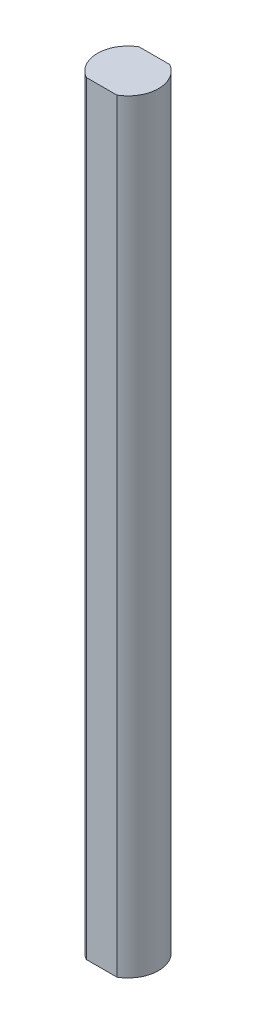
ISO-10303-21;
HEADER;
FILE_DESCRIPTION(('STEP AP214'),'2;1');
FILE_NAME('part.step','',(''),(''),'','','');
FILE_SCHEMA(('AUTOMOTIVE_DESIGN { 1 0 10303 214 1 1 1 1 }'));
ENDSEC;
DATA;
#1=APPLICATION_CONTEXT('core data for automotive mechanical design processes');
#2=APPLICATION_PROTOCOL_DEFINITION('international standard','automotive_design',2000,#1);
#3=PRODUCT_CONTEXT('',#1,'mechanical');
#4=PRODUCT('Part','Part','',(#3));
#5=PRODUCT_RELATED_PRODUCT_CATEGORY('part','',(#4));
#6=PRODUCT_DEFINITION_FORMATION('','',#4);
#7=PRODUCT_DEFINITION_CONTEXT('part definition',#1,'design');
#8=PRODUCT_DEFINITION('design','',#6,#7);
#9=PRODUCT_DEFINITION_SHAPE('','',#8);
#10=(LENGTH_UNIT() NAMED_UNIT(*) SI_UNIT(.MILLI.,.METRE.));
#11=(NAMED_UNIT(*) PLANE_ANGLE_UNIT() SI_UNIT($,.RADIAN.));
#12=(NAMED_UNIT(*) SI_UNIT($,.STERADIAN.) SOLID_ANGLE_UNIT());
#13=UNCERTAINTY_MEASURE_WITH_UNIT(LENGTH_MEASURE(1.E-05),#10,'distance_accuracy_value','');
#14=(GEOMETRIC_REPRESENTATION_CONTEXT(3) GLOBAL_UNCERTAINTY_ASSIGNED_CONTEXT((#13)) GLOBAL_UNIT_ASSIGNED_CONTEXT((#10,
#11,#12)) REPRESENTATION_CONTEXT('',''));
#15=CARTESIAN_POINT('',(0.,0.,0.));
#16=DIRECTION('',(0.,0.,1.));
#17=DIRECTION('',(1.,0.,0.));
#18=AXIS2_PLACEMENT_3D('',#15,#16,#17);
#19=CARTESIAN_POINT('',(0.,50.,0.));
#20=DIRECTION('',(0.,-1.,0.));
#21=DIRECTION('',(0.,0.,-1.));
#22=AXIS2_PLACEMENT_3D('',#19,#20,#21);
#23=CYLINDRICAL_SURFACE('',#22,4.);
#24=CARTESIAN_POINT('',(0.,-50.,0.));
#25=DIRECTION('',(0.,1.,0.));
#26=DIRECTION('',(0.,0.,1.));
#27=AXIS2_PLACEMENT_3D('',#24,#25,#26);
#28=CIRCLE('',#27,4.);
#29=CARTESIAN_POINT('',(2.,-50.,3.46410161513775));
#30=VERTEX_POINT('',#29);
#31=CARTESIAN_POINT('',(2.,-50.,-3.46410161513776));
#32=VERTEX_POINT('',#31);
#33=EDGE_CURVE('E113',#30,#32,#28,.T.);
#34=ORIENTED_EDGE('',*,*,#33,.T.);
#35=DIRECTION('',(0.,-1.,0.));
#36=VECTOR('',#35,1.);
#37=CARTESIAN_POINT('',(2.,50.,-3.46410161513776));
#38=LINE('',#37,#36);
#39=CARTESIAN_POINT('',(2.,50.,-3.46410161513776));
#40=VERTEX_POINT('',#39);
#41=EDGE_CURVE('E11',#40,#32,#38,.T.);
#42=ORIENTED_EDGE('',*,*,#41,.F.);
#43=CARTESIAN_POINT('',(0.,50.,0.));
#44=DIRECTION('',(0.,1.,0.));
#45=DIRECTION('',(0.,0.,1.));
#46=AXIS2_PLACEMENT_3D('',#43,#44,#45);
#47=CIRCLE('',#46,4.);
#48=CARTESIAN_POINT('',(2.,50.,3.46410161513775));
#49=VERTEX_POINT('',#48);
#50=EDGE_CURVE('E97',#49,#40,#47,.T.);
#51=ORIENTED_EDGE('',*,*,#50,.F.);
#52=DIRECTION('',(0.,-1.,0.));
#53=VECTOR('',#52,1.);
#54=CARTESIAN_POINT('',(2.,50.,3.46410161513775));
#55=LINE('',#54,#53);
#56=EDGE_CURVE('E109',#49,#30,#55,.T.);
#57=ORIENTED_EDGE('',*,*,#56,.T.);
#58=EDGE_LOOP('',(#34,#42,#51,#57));
#59=FACE_BOUND('',#58,.T.);
#60=ADVANCED_FACE('F45',(#59),#23,.T.);
#61=CARTESIAN_POINT('',(-2.,50.,-3.46410161513776));
#62=DIRECTION('',(0.,0.,1.));
#63=DIRECTION('',(1.,0.,0.));
#64=AXIS2_PLACEMENT_3D('',#61,#62,#63);
#65=PLANE('',#64);
#66=DIRECTION('',(-1.,0.,0.));
#67=VECTOR('',#66,1.);
#68=CARTESIAN_POINT('',(-2.,-50.,-3.46410161513776));
#69=LINE('',#68,#67);
#70=CARTESIAN_POINT('',(-2.,-50.,-3.46410161513776));
#71=VERTEX_POINT('',#70);
#72=EDGE_CURVE('E102',#32,#71,#69,.T.);
#73=ORIENTED_EDGE('',*,*,#72,.T.);
#74=DIRECTION('',(0.,-1.,0.));
#75=VECTOR('',#74,1.);
#76=CARTESIAN_POINT('',(-2.,50.,-3.46410161513776));
#77=LINE('',#76,#75);
#78=CARTESIAN_POINT('',(-2.,50.,-3.46410161513776));
#79=VERTEX_POINT('',#78);
#80=EDGE_CURVE('E54',#79,#71,#77,.T.);
#81=ORIENTED_EDGE('',*,*,#80,.F.);
#82=DIRECTION('',(-1.,0.,0.));
#83=VECTOR('',#82,1.);
#84=CARTESIAN_POINT('',(-2.,50.,-3.46410161513776));
#85=LINE('',#84,#83);
#86=EDGE_CURVE('E92',#40,#79,#85,.T.);
#87=ORIENTED_EDGE('',*,*,#86,.F.);
#88=ORIENTED_EDGE('',*,*,#41,.T.);
#89=EDGE_LOOP('',(#73,#81,#87,#88));
#90=FACE_BOUND('',#89,.T.);
#91=ADVANCED_FACE('F101',(#90),#65,.F.);
#92=CARTESIAN_POINT('',(0.,50.,0.));
#93=DIRECTION('',(0.,-1.,0.));
#94=DIRECTION('',(0.,0.,-1.));
#95=AXIS2_PLACEMENT_3D('',#92,#93,#94);
#96=CYLINDRICAL_SURFACE('',#95,4.);
#97=CARTESIAN_POINT('',(0.,-50.,0.));
#98=DIRECTION('',(0.,1.,0.));
#99=DIRECTION('',(0.,0.,1.));
#100=AXIS2_PLACEMENT_3D('',#97,#98,#99);
#101=CIRCLE('',#100,4.);
#102=CARTESIAN_POINT('',(-2.,-50.,3.46410161513775));
#103=VERTEX_POINT('',#102);
#104=EDGE_CURVE('E79',#71,#103,#101,.T.);
#105=ORIENTED_EDGE('',*,*,#104,.T.);
#106=DIRECTION('',(0.,-1.,0.));
#107=VECTOR('',#106,1.);
#108=CARTESIAN_POINT('',(-2.,50.,3.46410161513775));
#109=LINE('',#108,#107);
#110=CARTESIAN_POINT('',(-2.,50.,3.46410161513775));
#111=VERTEX_POINT('',#110);
#112=EDGE_CURVE('E104',#111,#103,#109,.T.);
#113=ORIENTED_EDGE('',*,*,#112,.F.);
#114=CARTESIAN_POINT('',(0.,50.,0.));
#115=DIRECTION('',(0.,1.,0.));
#116=DIRECTION('',(0.,0.,1.));
#117=AXIS2_PLACEMENT_3D('',#114,#115,#116);
#118=CIRCLE('',#117,4.);
#119=EDGE_CURVE('E95',#79,#111,#118,.T.);
#120=ORIENTED_EDGE('',*,*,#119,.F.);
#121=ORIENTED_EDGE('',*,*,#80,.T.);
#122=EDGE_LOOP('',(#105,#113,#120,#121));
#123=FACE_BOUND('',#122,.T.);
#124=ADVANCED_FACE('F105',(#123),#96,.T.);
#125=CARTESIAN_POINT('',(-2.,50.,3.46410161513775));
#126=DIRECTION('',(0.,0.,-1.));
#127=DIRECTION('',(-1.,0.,0.));
#128=AXIS2_PLACEMENT_3D('',#125,#126,#127);
#129=PLANE('',#128);
#130=DIRECTION('',(1.,0.,0.));
#131=VECTOR('',#130,1.);
#132=CARTESIAN_POINT('',(-2.,-50.,3.46410161513775));
#133=LINE('',#132,#131);
#134=EDGE_CURVE('E85',#103,#30,#133,.T.);
#135=ORIENTED_EDGE('',*,*,#134,.T.);
#136=ORIENTED_EDGE('',*,*,#56,.F.);
#137=DIRECTION('',(1.,0.,0.));
#138=VECTOR('',#137,1.);
#139=CARTESIAN_POINT('',(-2.,50.,3.46410161513775));
#140=LINE('',#139,#138);
#141=EDGE_CURVE('E62',#111,#49,#140,.T.);
#142=ORIENTED_EDGE('',*,*,#141,.F.);
#143=ORIENTED_EDGE('',*,*,#112,.T.);
#144=EDGE_LOOP('',(#135,#136,#142,#143));
#145=FACE_BOUND('',#144,.T.);
#146=ADVANCED_FACE('F126',(#145),#129,.F.);
#147=CARTESIAN_POINT('',(0.,50.,0.));
#148=DIRECTION('',(0.,1.,0.));
#149=DIRECTION('',(0.,0.,1.));
#150=AXIS2_PLACEMENT_3D('',#147,#148,#149);
#151=PLANE('',#150);
#152=ORIENTED_EDGE('',*,*,#50,.T.);
#153=ORIENTED_EDGE('',*,*,#86,.T.);
#154=ORIENTED_EDGE('',*,*,#119,.T.);
#155=ORIENTED_EDGE('',*,*,#141,.T.);
#156=EDGE_LOOP('',(#152,#153,#154,#155));
#157=FACE_BOUND('',#156,.T.);
#158=ADVANCED_FACE('F93',(#157),#151,.T.);
#159=CARTESIAN_POINT('',(0.,-50.,0.));
#160=DIRECTION('',(0.,1.,0.));
#161=DIRECTION('',(0.,0.,1.));
#162=AXIS2_PLACEMENT_3D('',#159,#160,#161);
#163=PLANE('',#162);
#164=ORIENTED_EDGE('',*,*,#33,.F.);
#165=ORIENTED_EDGE('',*,*,#134,.F.);
#166=ORIENTED_EDGE('',*,*,#104,.F.);
#167=ORIENTED_EDGE('',*,*,#72,.F.);
#168=EDGE_LOOP('',(#164,#165,#166,#167));
#169=FACE_BOUND('',#168,.T.);
#170=ADVANCED_FACE('F129',(#169),#163,.F.);
#171=CLOSED_SHELL('',(#60,#91,#124,#146,#158,#170));
#172=MANIFOLD_SOLID_BREP('B2',#171);
#173=ADVANCED_BREP_SHAPE_REPRESENTATION('',(#18,#172),#14);
#174=SHAPE_DEFINITION_REPRESENTATION(#9,#173);
ENDSEC;
END-ISO-10303-21;
